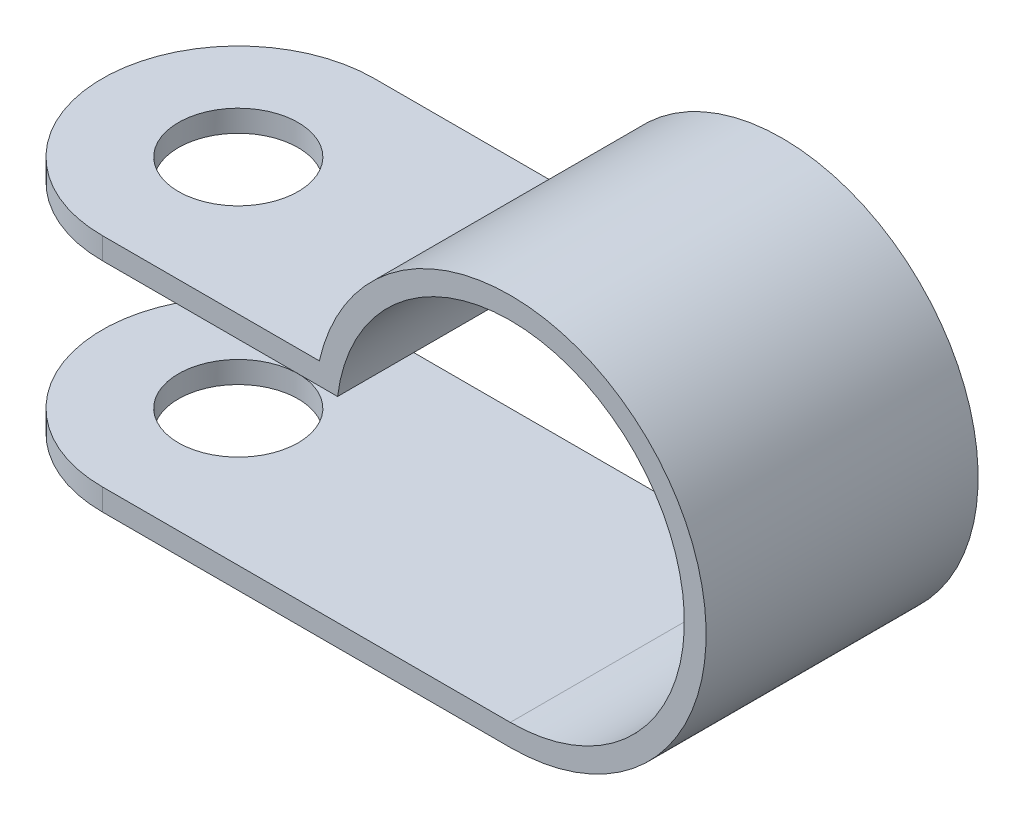
ISO-10303-21;
HEADER;
FILE_DESCRIPTION(('STEP AP214'),'2;1');
FILE_NAME('part.step','',(''),(''),'','','');
FILE_SCHEMA(('AUTOMOTIVE_DESIGN { 1 0 10303 214 1 1 1 1 }'));
ENDSEC;
DATA;
#1=APPLICATION_CONTEXT('core data for automotive mechanical design processes');
#2=APPLICATION_PROTOCOL_DEFINITION('international standard','automotive_design',2000,#1);
#3=PRODUCT_CONTEXT('',#1,'mechanical');
#4=PRODUCT('Part','Part','',(#3));
#5=PRODUCT_RELATED_PRODUCT_CATEGORY('part','',(#4));
#6=PRODUCT_DEFINITION_FORMATION('','',#4);
#7=PRODUCT_DEFINITION_CONTEXT('part definition',#1,'design');
#8=PRODUCT_DEFINITION('design','',#6,#7);
#9=PRODUCT_DEFINITION_SHAPE('','',#8);
#10=(LENGTH_UNIT() NAMED_UNIT(*) SI_UNIT(.MILLI.,.METRE.));
#11=(NAMED_UNIT(*) PLANE_ANGLE_UNIT() SI_UNIT($,.RADIAN.));
#12=(NAMED_UNIT(*) SI_UNIT($,.STERADIAN.) SOLID_ANGLE_UNIT());
#13=UNCERTAINTY_MEASURE_WITH_UNIT(LENGTH_MEASURE(1.E-05),#10,'distance_accuracy_value','');
#14=(GEOMETRIC_REPRESENTATION_CONTEXT(3) GLOBAL_UNCERTAINTY_ASSIGNED_CONTEXT((#13)) GLOBAL_UNIT_ASSIGNED_CONTEXT((#10,
#11,#12)) REPRESENTATION_CONTEXT('',''));
#15=CARTESIAN_POINT('',(0.,0.,0.));
#16=DIRECTION('',(0.,0.,1.));
#17=DIRECTION('',(1.,0.,0.));
#18=AXIS2_PLACEMENT_3D('',#15,#16,#17);
#19=CARTESIAN_POINT('',(0.,7.62,9.525));
#20=DIRECTION('',(0.,1.,0.));
#21=DIRECTION('',(-1.,0.,0.));
#22=AXIS2_PLACEMENT_3D('',#19,#20,#21);
#23=PLANE('',#22);
#24=CARTESIAN_POINT('',(4.7625,7.62,4.7625));
#25=DIRECTION('',(0.,1.,0.));
#26=DIRECTION('',(-1.,0.,0.));
#27=AXIS2_PLACEMENT_3D('',#24,#25,#26);
#28=CIRCLE('',#27,2.0955);
#29=CARTESIAN_POINT('',(2.667,7.62,4.7625));
#30=VERTEX_POINT('',#29);
#31=EDGE_CURVE('E165',#30,#30,#28,.T.);
#32=ORIENTED_EDGE('',*,*,#31,.T.);
#33=EDGE_LOOP('',(#32));
#34=FACE_BOUND('',#33,.T.);
#35=DIRECTION('',(1.,0.,0.));
#36=VECTOR('',#35,1.);
#37=CARTESIAN_POINT('',(0.,7.62,9.525));
#38=LINE('',#37,#36);
#39=CARTESIAN_POINT('',(4.7625,7.62,9.525));
#40=VERTEX_POINT('',#39);
#41=CARTESIAN_POINT('',(13.0018125029063,7.62,9.525));
#42=VERTEX_POINT('',#41);
#43=EDGE_CURVE('E177',#40,#42,#38,.T.);
#44=ORIENTED_EDGE('',*,*,#43,.F.);
#45=CARTESIAN_POINT('',(4.7625,7.62,4.7625));
#46=DIRECTION('',(0.,1.,0.));
#47=DIRECTION('',(-1.,0.,0.));
#48=AXIS2_PLACEMENT_3D('',#45,#46,#47);
#49=CIRCLE('',#48,4.7625);
#50=CARTESIAN_POINT('',(4.7625,7.62,0.));
#51=VERTEX_POINT('',#50);
#52=EDGE_CURVE('E188',#40,#51,#49,.F.);
#53=ORIENTED_EDGE('',*,*,#52,.T.);
#54=DIRECTION('',(1.,0.,0.));
#55=VECTOR('',#54,1.);
#56=CARTESIAN_POINT('',(0.,7.62,0.));
#57=LINE('',#56,#55);
#58=CARTESIAN_POINT('',(13.0018125029063,7.62,0.));
#59=VERTEX_POINT('',#58);
#60=EDGE_CURVE('E162',#51,#59,#57,.T.);
#61=ORIENTED_EDGE('',*,*,#60,.T.);
#62=DIRECTION('',(0.,0.,-1.));
#63=VECTOR('',#62,1.);
#64=CARTESIAN_POINT('',(13.0018125029063,7.62,9.525));
#65=LINE('',#64,#63);
#66=EDGE_CURVE('E184',#42,#59,#65,.T.);
#67=ORIENTED_EDGE('',*,*,#66,.F.);
#68=EDGE_LOOP('',(#44,#53,#61,#67));
#69=FACE_BOUND('',#68,.T.);
#70=ADVANCED_FACE('F68',(#34,#69),#23,.F.);
#71=CARTESIAN_POINT('',(0.,0.762,9.525));
#72=DIRECTION('',(0.,-1.,0.));
#73=DIRECTION('',(1.,0.,0.));
#74=AXIS2_PLACEMENT_3D('',#71,#72,#73);
#75=PLANE('',#74);
#76=CARTESIAN_POINT('',(4.7625,0.761999999999999,4.7625));
#77=DIRECTION('',(0.,-1.,0.));
#78=DIRECTION('',(1.,0.,0.));
#79=AXIS2_PLACEMENT_3D('',#76,#77,#78);
#80=CIRCLE('',#79,2.0955);
#81=CARTESIAN_POINT('',(6.858,0.761999999999999,4.7625));
#82=VERTEX_POINT('',#81);
#83=EDGE_CURVE('E213',#82,#82,#80,.T.);
#84=ORIENTED_EDGE('',*,*,#83,.T.);
#85=EDGE_LOOP('',(#84));
#86=FACE_BOUND('',#85,.T.);
#87=CARTESIAN_POINT('',(4.7625,0.761999999999999,4.7625));
#88=DIRECTION('',(0.,-1.,0.));
#89=DIRECTION('',(1.,0.,0.));
#90=AXIS2_PLACEMENT_3D('',#87,#88,#89);
#91=CIRCLE('',#90,4.7625);
#92=CARTESIAN_POINT('',(4.7625,0.761999999999999,0.));
#93=VERTEX_POINT('',#92);
#94=CARTESIAN_POINT('',(4.7625,0.761999999999999,9.525));
#95=VERTEX_POINT('',#94);
#96=EDGE_CURVE('E82',#93,#95,#91,.F.);
#97=ORIENTED_EDGE('',*,*,#96,.T.);
#98=DIRECTION('',(-1.,0.,0.));
#99=VECTOR('',#98,1.);
#100=CARTESIAN_POINT('',(0.,0.762,9.525));
#101=LINE('',#100,#99);
#102=CARTESIAN_POINT('',(19.05,0.761999999999997,9.525));
#103=VERTEX_POINT('',#102);
#104=EDGE_CURVE('E146',#103,#95,#101,.T.);
#105=ORIENTED_EDGE('',*,*,#104,.F.);
#106=DIRECTION('',(0.,0.,-1.));
#107=VECTOR('',#106,1.);
#108=CARTESIAN_POINT('',(19.05,0.761999999999997,9.525));
#109=LINE('',#108,#107);
#110=CARTESIAN_POINT('',(19.05,0.761999999999997,0.));
#111=VERTEX_POINT('',#110);
#112=EDGE_CURVE('E181',#103,#111,#109,.T.);
#113=ORIENTED_EDGE('',*,*,#112,.T.);
#114=DIRECTION('',(-1.,0.,0.));
#115=VECTOR('',#114,1.);
#116=CARTESIAN_POINT('',(0.,0.762,0.));
#117=LINE('',#116,#115);
#118=EDGE_CURVE('E167',#111,#93,#117,.T.);
#119=ORIENTED_EDGE('',*,*,#118,.T.);
#120=EDGE_LOOP('',(#97,#105,#113,#119));
#121=FACE_BOUND('',#120,.T.);
#122=ADVANCED_FACE('F205',(#86,#121),#75,.F.);
#123=CARTESIAN_POINT('',(19.05,0.,9.525));
#124=DIRECTION('',(0.,1.,0.));
#125=DIRECTION('',(-1.,0.,0.));
#126=AXIS2_PLACEMENT_3D('',#123,#124,#125);
#127=PLANE('',#126);
#128=CARTESIAN_POINT('',(4.7625,0.,4.7625));
#129=DIRECTION('',(0.,1.,0.));
#130=DIRECTION('',(0.,0.,1.));
#131=AXIS2_PLACEMENT_3D('',#128,#129,#130);
#132=CIRCLE('',#131,2.0955);
#133=CARTESIAN_POINT('',(4.7625,0.,6.858));
#134=VERTEX_POINT('',#133);
#135=EDGE_CURVE('E210',#134,#134,#132,.T.);
#136=ORIENTED_EDGE('',*,*,#135,.T.);
#137=EDGE_LOOP('',(#136));
#138=FACE_BOUND('',#137,.T.);
#139=DIRECTION('',(1.,0.,0.));
#140=VECTOR('',#139,1.);
#141=CARTESIAN_POINT('',(19.05,0.,9.525));
#142=LINE('',#141,#140);
#143=CARTESIAN_POINT('',(4.7625,0.,9.525));
#144=VERTEX_POINT('',#143);
#145=CARTESIAN_POINT('',(19.05,0.,9.525));
#146=VERTEX_POINT('',#145);
#147=EDGE_CURVE('E143',#144,#146,#142,.T.);
#148=ORIENTED_EDGE('',*,*,#147,.F.);
#149=CARTESIAN_POINT('',(4.7625,0.,4.7625));
#150=DIRECTION('',(0.,1.,0.));
#151=DIRECTION('',(0.,0.,1.));
#152=AXIS2_PLACEMENT_3D('',#149,#150,#151);
#153=CIRCLE('',#152,4.7625);
#154=CARTESIAN_POINT('',(4.7625,0.,0.));
#155=VERTEX_POINT('',#154);
#156=EDGE_CURVE('E130',#144,#155,#153,.F.);
#157=ORIENTED_EDGE('',*,*,#156,.T.);
#158=DIRECTION('',(1.,0.,0.));
#159=VECTOR('',#158,1.);
#160=CARTESIAN_POINT('',(19.05,0.,0.));
#161=LINE('',#160,#159);
#162=CARTESIAN_POINT('',(19.05,0.,0.));
#163=VERTEX_POINT('',#162);
#164=EDGE_CURVE('E170',#155,#163,#161,.T.);
#165=ORIENTED_EDGE('',*,*,#164,.T.);
#166=DIRECTION('',(0.,0.,-1.));
#167=VECTOR('',#166,1.);
#168=CARTESIAN_POINT('',(19.05,0.,9.525));
#169=LINE('',#168,#167);
#170=EDGE_CURVE('E150',#146,#163,#169,.T.);
#171=ORIENTED_EDGE('',*,*,#170,.F.);
#172=EDGE_LOOP('',(#148,#157,#165,#171));
#173=FACE_BOUND('',#172,.T.);
#174=ADVANCED_FACE('F148',(#138,#173),#127,.F.);
#175=CARTESIAN_POINT('',(0.,8.382,9.525));
#176=DIRECTION('',(0.,-1.,0.));
#177=DIRECTION('',(0.,0.,-1.));
#178=AXIS2_PLACEMENT_3D('',#175,#176,#177);
#179=PLANE('',#178);
#180=CARTESIAN_POINT('',(4.7625,8.382,4.7625));
#181=DIRECTION('',(0.,1.,0.));
#182=DIRECTION('',(0.,0.,1.));
#183=AXIS2_PLACEMENT_3D('',#180,#181,#182);
#184=CIRCLE('',#183,2.0955);
#185=CARTESIAN_POINT('',(4.7625,8.382,6.858));
#186=VERTEX_POINT('',#185);
#187=EDGE_CURVE('E195',#186,#186,#184,.T.);
#188=ORIENTED_EDGE('',*,*,#187,.F.);
#189=EDGE_LOOP('',(#188));
#190=FACE_BOUND('',#189,.T.);
#191=CARTESIAN_POINT('',(4.7625,8.382,4.7625));
#192=DIRECTION('',(0.,1.,0.));
#193=DIRECTION('',(0.,0.,1.));
#194=AXIS2_PLACEMENT_3D('',#191,#192,#193);
#195=CIRCLE('',#194,4.7625);
#196=CARTESIAN_POINT('',(4.7625,8.382,9.525));
#197=VERTEX_POINT('',#196);
#198=CARTESIAN_POINT('',(4.7625,8.382,0.));
#199=VERTEX_POINT('',#198);
#200=EDGE_CURVE('E90',#197,#199,#195,.F.);
#201=ORIENTED_EDGE('',*,*,#200,.F.);
#202=DIRECTION('',(-1.,0.,0.));
#203=VECTOR('',#202,1.);
#204=CARTESIAN_POINT('',(0.,8.382,9.525));
#205=LINE('',#204,#203);
#206=CARTESIAN_POINT('',(12.3634771368072,8.382,9.525));
#207=VERTEX_POINT('',#206);
#208=EDGE_CURVE('E154',#207,#197,#205,.T.);
#209=ORIENTED_EDGE('',*,*,#208,.F.);
#210=DIRECTION('',(0.,0.,-1.));
#211=VECTOR('',#210,1.);
#212=CARTESIAN_POINT('',(12.3634771368072,8.382,9.525));
#213=LINE('',#212,#211);
#214=CARTESIAN_POINT('',(12.3634771368072,8.382,0.));
#215=VERTEX_POINT('',#214);
#216=EDGE_CURVE('E161',#207,#215,#213,.T.);
#217=ORIENTED_EDGE('',*,*,#216,.T.);
#218=DIRECTION('',(-1.,0.,0.));
#219=VECTOR('',#218,1.);
#220=CARTESIAN_POINT('',(0.,8.382,0.));
#221=LINE('',#220,#219);
#222=EDGE_CURVE('E174',#215,#199,#221,.T.);
#223=ORIENTED_EDGE('',*,*,#222,.T.);
#224=EDGE_LOOP('',(#201,#209,#217,#223));
#225=FACE_BOUND('',#224,.T.);
#226=ADVANCED_FACE('F223',(#190,#225),#179,.F.);
#227=CARTESIAN_POINT('',(19.05,6.858,9.525));
#228=DIRECTION('',(0.,0.,-1.));
#229=DIRECTION('',(-1.,0.,0.));
#230=AXIS2_PLACEMENT_3D('',#227,#228,#229);
#231=CYLINDRICAL_SURFACE('',#230,6.096);
#232=CARTESIAN_POINT('',(19.05,6.858,0.));
#233=DIRECTION('',(0.,0.,-1.));
#234=DIRECTION('',(-1.,0.,0.));
#235=AXIS2_PLACEMENT_3D('',#232,#233,#234);
#236=CIRCLE('',#235,6.096);
#237=EDGE_CURVE('E164',#59,#111,#236,.T.);
#238=ORIENTED_EDGE('',*,*,#237,.T.);
#239=ORIENTED_EDGE('',*,*,#112,.F.);
#240=CARTESIAN_POINT('',(19.05,6.858,9.525));
#241=DIRECTION('',(0.,0.,-1.));
#242=DIRECTION('',(-1.,0.,0.));
#243=AXIS2_PLACEMENT_3D('',#240,#241,#242);
#244=CIRCLE('',#243,6.096);
#245=EDGE_CURVE('E156',#42,#103,#244,.T.);
#246=ORIENTED_EDGE('',*,*,#245,.F.);
#247=ORIENTED_EDGE('',*,*,#66,.T.);
#248=EDGE_LOOP('',(#238,#239,#246,#247));
#249=FACE_BOUND('',#248,.T.);
#250=ADVANCED_FACE('F202',(#249),#231,.F.);
#251=CARTESIAN_POINT('',(19.05,6.858,9.525));
#252=DIRECTION('',(0.,0.,-1.));
#253=DIRECTION('',(-1.,0.,0.));
#254=AXIS2_PLACEMENT_3D('',#251,#252,#253);
#255=CYLINDRICAL_SURFACE('',#254,6.858);
#256=CARTESIAN_POINT('',(19.05,6.858,0.));
#257=DIRECTION('',(0.,0.,1.));
#258=DIRECTION('',(-1.,0.,0.));
#259=AXIS2_PLACEMENT_3D('',#256,#257,#258);
#260=CIRCLE('',#259,6.858);
#261=EDGE_CURVE('E172',#163,#215,#260,.T.);
#262=ORIENTED_EDGE('',*,*,#261,.T.);
#263=ORIENTED_EDGE('',*,*,#216,.F.);
#264=CARTESIAN_POINT('',(19.05,6.858,9.525));
#265=DIRECTION('',(0.,0.,1.));
#266=DIRECTION('',(-1.,0.,0.));
#267=AXIS2_PLACEMENT_3D('',#264,#265,#266);
#268=CIRCLE('',#267,6.858);
#269=EDGE_CURVE('E152',#146,#207,#268,.T.);
#270=ORIENTED_EDGE('',*,*,#269,.F.);
#271=ORIENTED_EDGE('',*,*,#170,.T.);
#272=EDGE_LOOP('',(#262,#263,#270,#271));
#273=FACE_BOUND('',#272,.T.);
#274=ADVANCED_FACE('F226',(#273),#255,.T.);
#275=CARTESIAN_POINT('',(19.05,6.858,9.525));
#276=DIRECTION('',(0.,0.,-1.));
#277=DIRECTION('',(-1.,0.,0.));
#278=AXIS2_PLACEMENT_3D('',#275,#276,#277);
#279=PLANE('',#278);
#280=ORIENTED_EDGE('',*,*,#208,.T.);
#281=DIRECTION('',(0.,1.,0.));
#282=VECTOR('',#281,1.);
#283=CARTESIAN_POINT('',(4.7625,0.,9.525));
#284=LINE('',#283,#282);
#285=EDGE_CURVE('E14',#197,#40,#284,.F.);
#286=ORIENTED_EDGE('',*,*,#285,.T.);
#287=ORIENTED_EDGE('',*,*,#43,.T.);
#288=ORIENTED_EDGE('',*,*,#245,.T.);
#289=ORIENTED_EDGE('',*,*,#104,.T.);
#290=DIRECTION('',(0.,1.,0.));
#291=VECTOR('',#290,1.);
#292=CARTESIAN_POINT('',(4.7625,0.,9.525));
#293=LINE('',#292,#291);
#294=EDGE_CURVE('E133',#144,#95,#293,.T.);
#295=ORIENTED_EDGE('',*,*,#294,.F.);
#296=ORIENTED_EDGE('',*,*,#147,.T.);
#297=ORIENTED_EDGE('',*,*,#269,.T.);
#298=EDGE_LOOP('',(#280,#286,#287,#288,#289,#295,#296,#297));
#299=FACE_BOUND('',#298,.T.);
#300=ADVANCED_FACE('F142',(#299),#279,.F.);
#301=CARTESIAN_POINT('',(19.05,6.858,0.));
#302=DIRECTION('',(0.,0.,-1.));
#303=DIRECTION('',(-1.,0.,0.));
#304=AXIS2_PLACEMENT_3D('',#301,#302,#303);
#305=PLANE('',#304);
#306=DIRECTION('',(0.,1.,0.));
#307=VECTOR('',#306,1.);
#308=CARTESIAN_POINT('',(4.7625,0.,0.));
#309=LINE('',#308,#307);
#310=EDGE_CURVE('E75',#199,#51,#309,.F.);
#311=ORIENTED_EDGE('',*,*,#310,.F.);
#312=ORIENTED_EDGE('',*,*,#222,.F.);
#313=ORIENTED_EDGE('',*,*,#261,.F.);
#314=ORIENTED_EDGE('',*,*,#164,.F.);
#315=DIRECTION('',(0.,1.,0.));
#316=VECTOR('',#315,1.);
#317=CARTESIAN_POINT('',(4.7625,0.,0.));
#318=LINE('',#317,#316);
#319=EDGE_CURVE('E135',#155,#93,#318,.T.);
#320=ORIENTED_EDGE('',*,*,#319,.T.);
#321=ORIENTED_EDGE('',*,*,#118,.F.);
#322=ORIENTED_EDGE('',*,*,#237,.F.);
#323=ORIENTED_EDGE('',*,*,#60,.F.);
#324=EDGE_LOOP('',(#311,#312,#313,#314,#320,#321,#322,#323));
#325=FACE_BOUND('',#324,.T.);
#326=ADVANCED_FACE('F198',(#325),#305,.T.);
#327=CARTESIAN_POINT('',(4.7625,0.,4.7625));
#328=DIRECTION('',(0.,1.,0.));
#329=DIRECTION('',(0.,0.,1.));
#330=AXIS2_PLACEMENT_3D('',#327,#328,#329);
#331=CYLINDRICAL_SURFACE('',#330,2.0955);
#332=ORIENTED_EDGE('',*,*,#187,.T.);
#333=EDGE_LOOP('',(#332));
#334=FACE_BOUND('',#333,.T.);
#335=ORIENTED_EDGE('',*,*,#31,.F.);
#336=EDGE_LOOP('',(#335));
#337=FACE_BOUND('',#336,.T.);
#338=ADVANCED_FACE('F245',(#334,#337),#331,.F.);
#339=ORIENTED_EDGE('',*,*,#135,.F.);
#340=EDGE_LOOP('',(#339));
#341=FACE_BOUND('',#340,.T.);
#342=ORIENTED_EDGE('',*,*,#83,.F.);
#343=EDGE_LOOP('',(#342));
#344=FACE_BOUND('',#343,.T.);
#345=ADVANCED_FACE('F247',(#341,#344),#331,.F.);
#346=CARTESIAN_POINT('',(4.7625,0.,4.7625));
#347=DIRECTION('',(0.,1.,0.));
#348=DIRECTION('',(0.,0.,1.));
#349=AXIS2_PLACEMENT_3D('',#346,#347,#348);
#350=CYLINDRICAL_SURFACE('',#349,4.7625);
#351=ORIENTED_EDGE('',*,*,#319,.F.);
#352=ORIENTED_EDGE('',*,*,#156,.F.);
#353=ORIENTED_EDGE('',*,*,#294,.T.);
#354=ORIENTED_EDGE('',*,*,#96,.F.);
#355=EDGE_LOOP('',(#351,#352,#353,#354));
#356=FACE_BOUND('',#355,.T.);
#357=ADVANCED_FACE('F132',(#356),#350,.T.);
#358=ORIENTED_EDGE('',*,*,#52,.F.);
#359=ORIENTED_EDGE('',*,*,#285,.F.);
#360=ORIENTED_EDGE('',*,*,#200,.T.);
#361=ORIENTED_EDGE('',*,*,#310,.T.);
#362=EDGE_LOOP('',(#358,#359,#360,#361));
#363=FACE_BOUND('',#362,.T.);
#364=ADVANCED_FACE('F187',(#363),#350,.T.);
#365=CLOSED_SHELL('',(#70,#122,#174,#226,#250,#274,#300,#326,#338,#345,#357,#364));
#366=MANIFOLD_SOLID_BREP('B2',#365);
#367=ADVANCED_BREP_SHAPE_REPRESENTATION('',(#18,#366),#14);
#368=SHAPE_DEFINITION_REPRESENTATION(#9,#367);
ENDSEC;
END-ISO-10303-21;
